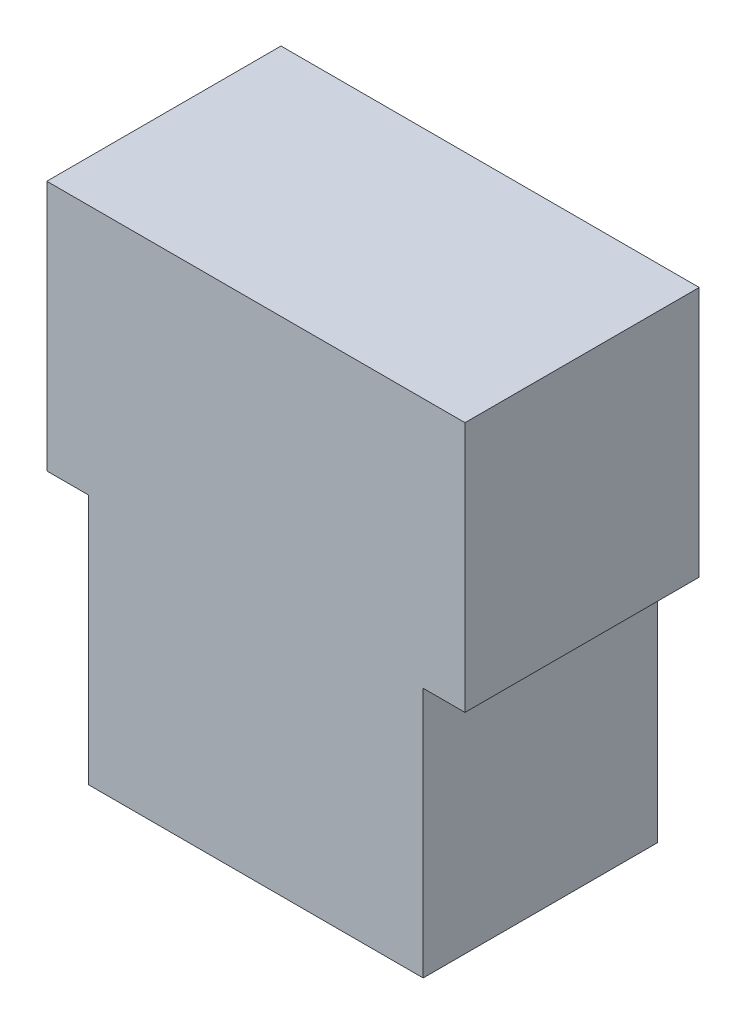
ISO-10303-21;
HEADER;
FILE_DESCRIPTION(('STEP AP214'),'2;1');
FILE_NAME('part.step','',(''),(''),'','','');
FILE_SCHEMA(('AUTOMOTIVE_DESIGN { 1 0 10303 214 1 1 1 1 }'));
ENDSEC;
DATA;
#1=APPLICATION_CONTEXT('core data for automotive mechanical design processes');
#2=APPLICATION_PROTOCOL_DEFINITION('international standard','automotive_design',2000,#1);
#3=PRODUCT_CONTEXT('',#1,'mechanical');
#4=PRODUCT('Part','Part','',(#3));
#5=PRODUCT_RELATED_PRODUCT_CATEGORY('part','',(#4));
#6=PRODUCT_DEFINITION_FORMATION('','',#4);
#7=PRODUCT_DEFINITION_CONTEXT('part definition',#1,'design');
#8=PRODUCT_DEFINITION('design','',#6,#7);
#9=PRODUCT_DEFINITION_SHAPE('','',#8);
#10=(LENGTH_UNIT() NAMED_UNIT(*) SI_UNIT(.MILLI.,.METRE.));
#11=(NAMED_UNIT(*) PLANE_ANGLE_UNIT() SI_UNIT($,.RADIAN.));
#12=(NAMED_UNIT(*) SI_UNIT($,.STERADIAN.) SOLID_ANGLE_UNIT());
#13=UNCERTAINTY_MEASURE_WITH_UNIT(LENGTH_MEASURE(1.E-05),#10,'distance_accuracy_value','');
#14=(GEOMETRIC_REPRESENTATION_CONTEXT(3) GLOBAL_UNCERTAINTY_ASSIGNED_CONTEXT((#13)) GLOBAL_UNIT_ASSIGNED_CONTEXT((#10,
#11,#12)) REPRESENTATION_CONTEXT('',''));
#15=CARTESIAN_POINT('',(0.,0.,0.));
#16=DIRECTION('',(0.,0.,1.));
#17=DIRECTION('',(1.,0.,0.));
#18=AXIS2_PLACEMENT_3D('',#15,#16,#17);
#19=CARTESIAN_POINT('',(-0.2499995,0.30000194,0.27999944));
#20=DIRECTION('',(0.,0.,1.));
#21=DIRECTION('',(1.,0.,0.));
#22=AXIS2_PLACEMENT_3D('',#19,#20,#21);
#23=PLANE('',#22);
#24=DIRECTION('',(0.,1.,0.));
#25=VECTOR('',#24,1.);
#26=CARTESIAN_POINT('',(0.1999996,0.,0.27999944));
#27=LINE('',#26,#25);
#28=CARTESIAN_POINT('',(0.1999996,0.,0.27999944));
#29=VERTEX_POINT('',#28);
#30=CARTESIAN_POINT('',(0.1999996,-0.2999994,0.27999944));
#31=VERTEX_POINT('',#30);
#32=EDGE_CURVE('E114',#29,#31,#27,.F.);
#33=ORIENTED_EDGE('',*,*,#32,.F.);
#34=DIRECTION('',(1.,0.,0.));
#35=VECTOR('',#34,1.);
#36=CARTESIAN_POINT('',(0.2499995,0.,0.27999944));
#37=LINE('',#36,#35);
#38=CARTESIAN_POINT('',(0.2499995,0.,0.27999944));
#39=VERTEX_POINT('',#38);
#40=EDGE_CURVE('E119',#39,#29,#37,.F.);
#41=ORIENTED_EDGE('',*,*,#40,.F.);
#42=DIRECTION('',(0.,1.,0.));
#43=VECTOR('',#42,1.);
#44=CARTESIAN_POINT('',(0.2499995,0.30000194,0.27999944));
#45=LINE('',#44,#43);
#46=CARTESIAN_POINT('',(0.2499995,0.30000194,0.27999944));
#47=VERTEX_POINT('',#46);
#48=EDGE_CURVE('E82',#47,#39,#45,.F.);
#49=ORIENTED_EDGE('',*,*,#48,.F.);
#50=DIRECTION('',(1.,0.,0.));
#51=VECTOR('',#50,1.);
#52=CARTESIAN_POINT('',(-0.2499995,0.30000194,0.27999944));
#53=LINE('',#52,#51);
#54=CARTESIAN_POINT('',(-0.2499995,0.30000194,0.27999944));
#55=VERTEX_POINT('',#54);
#56=EDGE_CURVE('E20',#55,#47,#53,.T.);
#57=ORIENTED_EDGE('',*,*,#56,.F.);
#58=DIRECTION('',(0.,1.,0.));
#59=VECTOR('',#58,1.);
#60=CARTESIAN_POINT('',(-0.2499995,0.,0.27999944));
#61=LINE('',#60,#59);
#62=CARTESIAN_POINT('',(-0.2499995,0.,0.27999944));
#63=VERTEX_POINT('',#62);
#64=EDGE_CURVE('E79',#63,#55,#61,.T.);
#65=ORIENTED_EDGE('',*,*,#64,.F.);
#66=DIRECTION('',(1.,0.,0.));
#67=VECTOR('',#66,1.);
#68=CARTESIAN_POINT('',(-0.1999996,0.,0.27999944));
#69=LINE('',#68,#67);
#70=CARTESIAN_POINT('',(-0.1999996,0.,0.27999944));
#71=VERTEX_POINT('',#70);
#72=EDGE_CURVE('E100',#71,#63,#69,.F.);
#73=ORIENTED_EDGE('',*,*,#72,.F.);
#74=DIRECTION('',(0.,1.,0.));
#75=VECTOR('',#74,1.);
#76=CARTESIAN_POINT('',(-0.1999996,-0.2999994,0.27999944));
#77=LINE('',#76,#75);
#78=CARTESIAN_POINT('',(-0.1999996,-0.2999994,0.27999944));
#79=VERTEX_POINT('',#78);
#80=EDGE_CURVE('E104',#79,#71,#77,.T.);
#81=ORIENTED_EDGE('',*,*,#80,.F.);
#82=DIRECTION('',(1.,0.,0.));
#83=VECTOR('',#82,1.);
#84=CARTESIAN_POINT('',(0.1999996,-0.2999994,0.27999944));
#85=LINE('',#84,#83);
#86=EDGE_CURVE('E109',#31,#79,#85,.F.);
#87=ORIENTED_EDGE('',*,*,#86,.F.);
#88=EDGE_LOOP('',(#33,#41,#49,#57,#65,#73,#81,#87));
#89=FACE_BOUND('',#88,.T.);
#90=ADVANCED_FACE('F17',(#89),#23,.T.);
#91=CARTESIAN_POINT('',(-0.2499995,0.30000194,0.));
#92=DIRECTION('',(0.,1.,0.));
#93=DIRECTION('',(0.,0.,1.));
#94=AXIS2_PLACEMENT_3D('',#91,#92,#93);
#95=PLANE('',#94);
#96=DIRECTION('',(0.,0.,1.));
#97=VECTOR('',#96,1.);
#98=CARTESIAN_POINT('',(-0.2499995,0.30000194,0.));
#99=LINE('',#98,#97);
#100=CARTESIAN_POINT('',(-0.2499995,0.30000194,0.));
#101=VERTEX_POINT('',#100);
#102=EDGE_CURVE('E87',#55,#101,#99,.F.);
#103=ORIENTED_EDGE('',*,*,#102,.F.);
#104=ORIENTED_EDGE('',*,*,#56,.T.);
#105=DIRECTION('',(0.,0.,-1.));
#106=VECTOR('',#105,1.);
#107=CARTESIAN_POINT('',(0.2499995,0.30000194,0.));
#108=LINE('',#107,#106);
#109=CARTESIAN_POINT('',(0.2499995,0.30000194,0.));
#110=VERTEX_POINT('',#109);
#111=EDGE_CURVE('E123',#110,#47,#108,.F.);
#112=ORIENTED_EDGE('',*,*,#111,.F.);
#113=DIRECTION('',(1.,0.,0.));
#114=VECTOR('',#113,1.);
#115=CARTESIAN_POINT('',(-0.2499995,0.30000194,0.));
#116=LINE('',#115,#114);
#117=EDGE_CURVE('E97',#110,#101,#116,.F.);
#118=ORIENTED_EDGE('',*,*,#117,.T.);
#119=EDGE_LOOP('',(#103,#104,#112,#118));
#120=FACE_BOUND('',#119,.T.);
#121=ADVANCED_FACE('F96',(#120),#95,.T.);
#122=CARTESIAN_POINT('',(-0.2499995,0.,0.));
#123=DIRECTION('',(-1.,0.,0.));
#124=DIRECTION('',(0.,0.,1.));
#125=AXIS2_PLACEMENT_3D('',#122,#123,#124);
#126=PLANE('',#125);
#127=DIRECTION('',(0.,0.,-1.));
#128=VECTOR('',#127,1.);
#129=CARTESIAN_POINT('',(-0.2499995,0.,0.));
#130=LINE('',#129,#128);
#131=CARTESIAN_POINT('',(-0.2499995,0.,0.));
#132=VERTEX_POINT('',#131);
#133=EDGE_CURVE('E93',#63,#132,#130,.T.);
#134=ORIENTED_EDGE('',*,*,#133,.F.);
#135=ORIENTED_EDGE('',*,*,#64,.T.);
#136=ORIENTED_EDGE('',*,*,#102,.T.);
#137=DIRECTION('',(0.,1.,0.));
#138=VECTOR('',#137,1.);
#139=CARTESIAN_POINT('',(-0.2499995,0.30000194,0.));
#140=LINE('',#139,#138);
#141=EDGE_CURVE('E127',#101,#132,#140,.F.);
#142=ORIENTED_EDGE('',*,*,#141,.T.);
#143=EDGE_LOOP('',(#134,#135,#136,#142));
#144=FACE_BOUND('',#143,.T.);
#145=ADVANCED_FACE('F90',(#144),#126,.T.);
#146=CARTESIAN_POINT('',(-0.1999996,0.,0.));
#147=DIRECTION('',(0.,-1.,0.));
#148=DIRECTION('',(0.,0.,-1.));
#149=AXIS2_PLACEMENT_3D('',#146,#147,#148);
#150=PLANE('',#149);
#151=DIRECTION('',(0.,0.,1.));
#152=VECTOR('',#151,1.);
#153=CARTESIAN_POINT('',(-0.1999996,0.,0.));
#154=LINE('',#153,#152);
#155=CARTESIAN_POINT('',(-0.1999996,0.,0.));
#156=VERTEX_POINT('',#155);
#157=EDGE_CURVE('E102',#71,#156,#154,.F.);
#158=ORIENTED_EDGE('',*,*,#157,.F.);
#159=ORIENTED_EDGE('',*,*,#72,.T.);
#160=ORIENTED_EDGE('',*,*,#133,.T.);
#161=DIRECTION('',(1.,0.,0.));
#162=VECTOR('',#161,1.);
#163=CARTESIAN_POINT('',(-0.2499995,0.,0.));
#164=LINE('',#163,#162);
#165=EDGE_CURVE('E129',#132,#156,#164,.T.);
#166=ORIENTED_EDGE('',*,*,#165,.T.);
#167=EDGE_LOOP('',(#158,#159,#160,#166));
#168=FACE_BOUND('',#167,.T.);
#169=ADVANCED_FACE('F162',(#168),#150,.T.);
#170=CARTESIAN_POINT('',(-0.1999996,-0.2999994,0.));
#171=DIRECTION('',(-1.,0.,0.));
#172=DIRECTION('',(0.,0.,1.));
#173=AXIS2_PLACEMENT_3D('',#170,#171,#172);
#174=PLANE('',#173);
#175=DIRECTION('',(0.,0.,-1.));
#176=VECTOR('',#175,1.);
#177=CARTESIAN_POINT('',(-0.1999996,-0.2999994,0.));
#178=LINE('',#177,#176);
#179=CARTESIAN_POINT('',(-0.1999996,-0.2999994,0.));
#180=VERTEX_POINT('',#179);
#181=EDGE_CURVE('E107',#79,#180,#178,.T.);
#182=ORIENTED_EDGE('',*,*,#181,.F.);
#183=ORIENTED_EDGE('',*,*,#80,.T.);
#184=ORIENTED_EDGE('',*,*,#157,.T.);
#185=DIRECTION('',(0.,1.,0.));
#186=VECTOR('',#185,1.);
#187=CARTESIAN_POINT('',(-0.1999996,0.30000194,0.));
#188=LINE('',#187,#186);
#189=EDGE_CURVE('E132',#156,#180,#188,.F.);
#190=ORIENTED_EDGE('',*,*,#189,.T.);
#191=EDGE_LOOP('',(#182,#183,#184,#190));
#192=FACE_BOUND('',#191,.T.);
#193=ADVANCED_FACE('F159',(#192),#174,.T.);
#194=CARTESIAN_POINT('',(0.1999996,-0.2999994,0.));
#195=DIRECTION('',(0.,-1.,0.));
#196=DIRECTION('',(0.,0.,-1.));
#197=AXIS2_PLACEMENT_3D('',#194,#195,#196);
#198=PLANE('',#197);
#199=DIRECTION('',(0.,0.,-1.));
#200=VECTOR('',#199,1.);
#201=CARTESIAN_POINT('',(0.1999996,-0.2999994,0.));
#202=LINE('',#201,#200);
#203=CARTESIAN_POINT('',(0.1999996,-0.2999994,0.));
#204=VERTEX_POINT('',#203);
#205=EDGE_CURVE('E112',#31,#204,#202,.T.);
#206=ORIENTED_EDGE('',*,*,#205,.F.);
#207=ORIENTED_EDGE('',*,*,#86,.T.);
#208=ORIENTED_EDGE('',*,*,#181,.T.);
#209=DIRECTION('',(1.,0.,0.));
#210=VECTOR('',#209,1.);
#211=CARTESIAN_POINT('',(-0.2499995,-0.2999994,0.));
#212=LINE('',#211,#210);
#213=EDGE_CURVE('E135',#180,#204,#212,.T.);
#214=ORIENTED_EDGE('',*,*,#213,.T.);
#215=EDGE_LOOP('',(#206,#207,#208,#214));
#216=FACE_BOUND('',#215,.T.);
#217=ADVANCED_FACE('F154',(#216),#198,.T.);
#218=CARTESIAN_POINT('',(0.1999996,0.,0.));
#219=DIRECTION('',(1.,0.,0.));
#220=DIRECTION('',(0.,0.,-1.));
#221=AXIS2_PLACEMENT_3D('',#218,#219,#220);
#222=PLANE('',#221);
#223=DIRECTION('',(0.,0.,-1.));
#224=VECTOR('',#223,1.);
#225=CARTESIAN_POINT('',(0.1999996,0.,0.));
#226=LINE('',#225,#224);
#227=CARTESIAN_POINT('',(0.1999996,0.,0.));
#228=VERTEX_POINT('',#227);
#229=EDGE_CURVE('E117',#29,#228,#226,.T.);
#230=ORIENTED_EDGE('',*,*,#229,.F.);
#231=ORIENTED_EDGE('',*,*,#32,.T.);
#232=ORIENTED_EDGE('',*,*,#205,.T.);
#233=DIRECTION('',(0.,1.,0.));
#234=VECTOR('',#233,1.);
#235=CARTESIAN_POINT('',(0.1999996,0.30000194,0.));
#236=LINE('',#235,#234);
#237=EDGE_CURVE('E138',#204,#228,#236,.T.);
#238=ORIENTED_EDGE('',*,*,#237,.T.);
#239=EDGE_LOOP('',(#230,#231,#232,#238));
#240=FACE_BOUND('',#239,.T.);
#241=ADVANCED_FACE('F151',(#240),#222,.T.);
#242=CARTESIAN_POINT('',(0.2499995,0.,0.));
#243=DIRECTION('',(0.,-1.,0.));
#244=DIRECTION('',(0.,0.,-1.));
#245=AXIS2_PLACEMENT_3D('',#242,#243,#244);
#246=PLANE('',#245);
#247=DIRECTION('',(0.,0.,-1.));
#248=VECTOR('',#247,1.);
#249=CARTESIAN_POINT('',(0.2499995,0.,0.));
#250=LINE('',#249,#248);
#251=CARTESIAN_POINT('',(0.2499995,0.,0.));
#252=VERTEX_POINT('',#251);
#253=EDGE_CURVE('E34',#39,#252,#250,.T.);
#254=ORIENTED_EDGE('',*,*,#253,.F.);
#255=ORIENTED_EDGE('',*,*,#40,.T.);
#256=ORIENTED_EDGE('',*,*,#229,.T.);
#257=DIRECTION('',(1.,0.,0.));
#258=VECTOR('',#257,1.);
#259=CARTESIAN_POINT('',(-0.2499995,0.,0.));
#260=LINE('',#259,#258);
#261=EDGE_CURVE('E26',#228,#252,#260,.T.);
#262=ORIENTED_EDGE('',*,*,#261,.T.);
#263=EDGE_LOOP('',(#254,#255,#256,#262));
#264=FACE_BOUND('',#263,.T.);
#265=ADVANCED_FACE('F144',(#264),#246,.T.);
#266=CARTESIAN_POINT('',(0.2499995,0.30000194,0.));
#267=DIRECTION('',(1.,0.,0.));
#268=DIRECTION('',(0.,0.,-1.));
#269=AXIS2_PLACEMENT_3D('',#266,#267,#268);
#270=PLANE('',#269);
#271=ORIENTED_EDGE('',*,*,#111,.T.);
#272=ORIENTED_EDGE('',*,*,#48,.T.);
#273=ORIENTED_EDGE('',*,*,#253,.T.);
#274=DIRECTION('',(0.,1.,0.));
#275=VECTOR('',#274,1.);
#276=CARTESIAN_POINT('',(0.2499995,0.30000194,0.));
#277=LINE('',#276,#275);
#278=EDGE_CURVE('E11',#252,#110,#277,.T.);
#279=ORIENTED_EDGE('',*,*,#278,.T.);
#280=EDGE_LOOP('',(#271,#272,#273,#279));
#281=FACE_BOUND('',#280,.T.);
#282=ADVANCED_FACE('F163',(#281),#270,.T.);
#283=CARTESIAN_POINT('',(-0.2499995,0.30000194,0.));
#284=DIRECTION('',(0.,0.,1.));
#285=DIRECTION('',(1.,0.,0.));
#286=AXIS2_PLACEMENT_3D('',#283,#284,#285);
#287=PLANE('',#286);
#288=ORIENTED_EDGE('',*,*,#261,.F.);
#289=ORIENTED_EDGE('',*,*,#237,.F.);
#290=ORIENTED_EDGE('',*,*,#213,.F.);
#291=ORIENTED_EDGE('',*,*,#189,.F.);
#292=ORIENTED_EDGE('',*,*,#165,.F.);
#293=ORIENTED_EDGE('',*,*,#141,.F.);
#294=ORIENTED_EDGE('',*,*,#117,.F.);
#295=ORIENTED_EDGE('',*,*,#278,.F.);
#296=EDGE_LOOP('',(#288,#289,#290,#291,#292,#293,#294,#295));
#297=FACE_BOUND('',#296,.T.);
#298=ADVANCED_FACE('F148',(#297),#287,.F.);
#299=CLOSED_SHELL('',(#90,#121,#145,#169,#193,#217,#241,#265,#282,#298));
#300=MANIFOLD_SOLID_BREP('B1',#299);
#301=ADVANCED_BREP_SHAPE_REPRESENTATION('',(#18,#300),#14);
#302=SHAPE_DEFINITION_REPRESENTATION(#9,#301);
ENDSEC;
END-ISO-10303-21;
